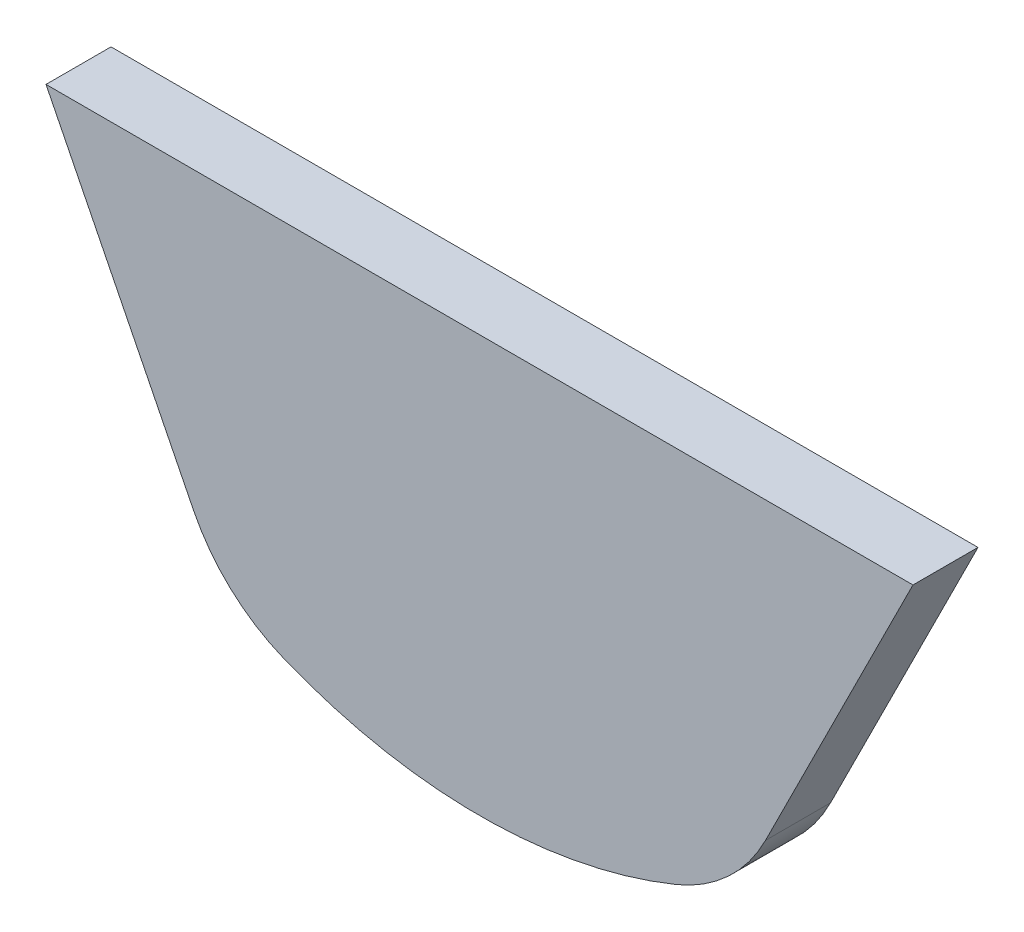
ISO-10303-21;
HEADER;
FILE_DESCRIPTION(('STEP AP214'),'2;1');
FILE_NAME('part.step','',(''),(''),'','','');
FILE_SCHEMA(('AUTOMOTIVE_DESIGN { 1 0 10303 214 1 1 1 1 }'));
ENDSEC;
DATA;
#1=APPLICATION_CONTEXT('core data for automotive mechanical design processes');
#2=APPLICATION_PROTOCOL_DEFINITION('international standard','automotive_design',2000,#1);
#3=PRODUCT_CONTEXT('',#1,'mechanical');
#4=PRODUCT('Part','Part','',(#3));
#5=PRODUCT_RELATED_PRODUCT_CATEGORY('part','',(#4));
#6=PRODUCT_DEFINITION_FORMATION('','',#4);
#7=PRODUCT_DEFINITION_CONTEXT('part definition',#1,'design');
#8=PRODUCT_DEFINITION('design','',#6,#7);
#9=PRODUCT_DEFINITION_SHAPE('','',#8);
#10=(LENGTH_UNIT() NAMED_UNIT(*) SI_UNIT(.MILLI.,.METRE.));
#11=(NAMED_UNIT(*) PLANE_ANGLE_UNIT() SI_UNIT($,.RADIAN.));
#12=(NAMED_UNIT(*) SI_UNIT($,.STERADIAN.) SOLID_ANGLE_UNIT());
#13=UNCERTAINTY_MEASURE_WITH_UNIT(LENGTH_MEASURE(1.E-05),#10,'distance_accuracy_value','');
#14=(GEOMETRIC_REPRESENTATION_CONTEXT(3) GLOBAL_UNCERTAINTY_ASSIGNED_CONTEXT((#13)) GLOBAL_UNIT_ASSIGNED_CONTEXT((#10,
#11,#12)) REPRESENTATION_CONTEXT('',''));
#15=CARTESIAN_POINT('',(0.,0.,0.));
#16=DIRECTION('',(0.,0.,1.));
#17=DIRECTION('',(1.,0.,0.));
#18=AXIS2_PLACEMENT_3D('',#15,#16,#17);
#19=CARTESIAN_POINT('',(-127.,0.,19.05));
#20=DIRECTION('',(0.894427190999916,0.447213595499958,0.));
#21=DIRECTION('',(-0.447213595499958,0.894427190999916,0.));
#22=AXIS2_PLACEMENT_3D('',#19,#20,#21);
#23=PLANE('',#22);
#24=DIRECTION('',(0.447213595499958,-0.894427190999916,0.));
#25=VECTOR('',#24,1.);
#26=CARTESIAN_POINT('',(-127.,0.,0.));
#27=LINE('',#26,#25);
#28=CARTESIAN_POINT('',(-127.,0.,0.));
#29=VERTEX_POINT('',#28);
#30=CARTESIAN_POINT('',(-83.7905524616866,-86.4188950766268,0.));
#31=VERTEX_POINT('',#30);
#32=EDGE_CURVE('E115',#29,#31,#27,.T.);
#33=ORIENTED_EDGE('',*,*,#32,.T.);
#34=DIRECTION('',(0.,0.,-1.));
#35=VECTOR('',#34,1.);
#36=CARTESIAN_POINT('',(-83.7905524616866,-86.4188950766268,19.05));
#37=LINE('',#36,#35);
#38=CARTESIAN_POINT('',(-83.7905524616866,-86.4188950766268,19.05));
#39=VERTEX_POINT('',#38);
#40=EDGE_CURVE('E11',#31,#39,#37,.F.);
#41=ORIENTED_EDGE('',*,*,#40,.T.);
#42=DIRECTION('',(0.447213595499958,-0.894427190999916,0.));
#43=VECTOR('',#42,1.);
#44=CARTESIAN_POINT('',(-127.,0.,19.05));
#45=LINE('',#44,#43);
#46=CARTESIAN_POINT('',(-127.,0.,19.05));
#47=VERTEX_POINT('',#46);
#48=EDGE_CURVE('E121',#47,#39,#45,.T.);
#49=ORIENTED_EDGE('',*,*,#48,.F.);
#50=DIRECTION('',(0.,0.,-1.));
#51=VECTOR('',#50,1.);
#52=CARTESIAN_POINT('',(-127.,0.,19.05));
#53=LINE('',#52,#51);
#54=EDGE_CURVE('E107',#47,#29,#53,.T.);
#55=ORIENTED_EDGE('',*,*,#54,.T.);
#56=EDGE_LOOP('',(#33,#41,#49,#55));
#57=FACE_BOUND('',#56,.T.);
#58=ADVANCED_FACE('F33',(#57),#23,.F.);
#59=CARTESIAN_POINT('',(0.,30.3822715367485,19.05));
#60=DIRECTION('',(0.,0.,-1.));
#61=DIRECTION('',(-1.,0.,0.));
#62=AXIS2_PLACEMENT_3D('',#59,#60,#61);
#63=CYLINDRICAL_SURFACE('',#62,152.4);
#64=CARTESIAN_POINT('',(0.,30.3822715367485,0.));
#65=DIRECTION('',(0.,0.,1.));
#66=DIRECTION('',(1.,0.,0.));
#67=AXIS2_PLACEMENT_3D('',#64,#65,#66);
#68=CIRCLE('',#67,152.4);
#69=CARTESIAN_POINT('',(-57.5304767383363,-110.741802406218,0.));
#70=VERTEX_POINT('',#69);
#71=CARTESIAN_POINT('',(57.5304767383364,-110.741802406218,0.));
#72=VERTEX_POINT('',#71);
#73=EDGE_CURVE('E117',#70,#72,#68,.T.);
#74=ORIENTED_EDGE('',*,*,#73,.T.);
#75=DIRECTION('',(0.,0.,-1.));
#76=VECTOR('',#75,1.);
#77=CARTESIAN_POINT('',(57.5304767383364,-110.741802406218,19.05));
#78=LINE('',#77,#76);
#79=CARTESIAN_POINT('',(57.5304767383364,-110.741802406218,19.05));
#80=VERTEX_POINT('',#79);
#81=EDGE_CURVE('E54',#72,#80,#78,.F.);
#82=ORIENTED_EDGE('',*,*,#81,.T.);
#83=CARTESIAN_POINT('',(0.,30.3822715367485,19.05));
#84=DIRECTION('',(0.,0.,1.));
#85=DIRECTION('',(1.,0.,0.));
#86=AXIS2_PLACEMENT_3D('',#83,#84,#85);
#87=CIRCLE('',#86,152.4);
#88=CARTESIAN_POINT('',(-57.5304767383363,-110.741802406218,19.05));
#89=VERTEX_POINT('',#88);
#90=EDGE_CURVE('E97',#89,#80,#87,.T.);
#91=ORIENTED_EDGE('',*,*,#90,.F.);
#92=DIRECTION('',(0.,0.,-1.));
#93=VECTOR('',#92,1.);
#94=CARTESIAN_POINT('',(-57.5304767383363,-110.741802406218,19.05));
#95=LINE('',#94,#93);
#96=EDGE_CURVE('E128',#89,#70,#95,.T.);
#97=ORIENTED_EDGE('',*,*,#96,.T.);
#98=EDGE_LOOP('',(#74,#82,#91,#97));
#99=FACE_BOUND('',#98,.T.);
#100=ADVANCED_FACE('F136',(#99),#63,.T.);
#101=CARTESIAN_POINT('',(76.2,-101.6,19.05));
#102=DIRECTION('',(-0.894427190999916,0.447213595499958,0.));
#103=DIRECTION('',(-0.447213595499958,-0.894427190999916,0.));
#104=AXIS2_PLACEMENT_3D('',#101,#102,#103);
#105=PLANE('',#104);
#106=DIRECTION('',(0.447213595499958,0.894427190999916,0.));
#107=VECTOR('',#106,1.);
#108=CARTESIAN_POINT('',(76.2,-101.6,19.05));
#109=LINE('',#108,#107);
#110=CARTESIAN_POINT('',(83.7905524616866,-86.4188950766267,19.05));
#111=VERTEX_POINT('',#110);
#112=CARTESIAN_POINT('',(127.,0.,19.05));
#113=VERTEX_POINT('',#112);
#114=EDGE_CURVE('E87',#111,#113,#109,.T.);
#115=ORIENTED_EDGE('',*,*,#114,.F.);
#116=DIRECTION('',(0.,0.,-1.));
#117=VECTOR('',#116,1.);
#118=CARTESIAN_POINT('',(83.7905524616866,-86.4188950766267,19.05));
#119=LINE('',#118,#117);
#120=CARTESIAN_POINT('',(83.7905524616866,-86.4188950766267,0.));
#121=VERTEX_POINT('',#120);
#122=EDGE_CURVE('E106',#111,#121,#119,.T.);
#123=ORIENTED_EDGE('',*,*,#122,.T.);
#124=DIRECTION('',(0.447213595499958,0.894427190999916,0.));
#125=VECTOR('',#124,1.);
#126=CARTESIAN_POINT('',(76.2,-101.6,0.));
#127=LINE('',#126,#125);
#128=CARTESIAN_POINT('',(127.,0.,0.));
#129=VERTEX_POINT('',#128);
#130=EDGE_CURVE('E103',#121,#129,#127,.T.);
#131=ORIENTED_EDGE('',*,*,#130,.T.);
#132=DIRECTION('',(0.,0.,-1.));
#133=VECTOR('',#132,1.);
#134=CARTESIAN_POINT('',(127.,0.,19.05));
#135=LINE('',#134,#133);
#136=EDGE_CURVE('E100',#113,#129,#135,.T.);
#137=ORIENTED_EDGE('',*,*,#136,.F.);
#138=EDGE_LOOP('',(#115,#123,#131,#137));
#139=FACE_BOUND('',#138,.T.);
#140=ADVANCED_FACE('F101',(#139),#105,.F.);
#141=CARTESIAN_POINT('',(-127.,0.,19.05));
#142=DIRECTION('',(0.,-1.,0.));
#143=DIRECTION('',(0.,0.,-1.));
#144=AXIS2_PLACEMENT_3D('',#141,#142,#143);
#145=PLANE('',#144);
#146=DIRECTION('',(-1.,0.,0.));
#147=VECTOR('',#146,1.);
#148=CARTESIAN_POINT('',(-127.,0.,0.));
#149=LINE('',#148,#147);
#150=EDGE_CURVE('E120',#129,#29,#149,.T.);
#151=ORIENTED_EDGE('',*,*,#150,.T.);
#152=ORIENTED_EDGE('',*,*,#54,.F.);
#153=DIRECTION('',(-1.,0.,0.));
#154=VECTOR('',#153,1.);
#155=CARTESIAN_POINT('',(-127.,0.,19.05));
#156=LINE('',#155,#154);
#157=EDGE_CURVE('E91',#113,#47,#156,.T.);
#158=ORIENTED_EDGE('',*,*,#157,.F.);
#159=ORIENTED_EDGE('',*,*,#136,.T.);
#160=EDGE_LOOP('',(#151,#152,#158,#159));
#161=FACE_BOUND('',#160,.T.);
#162=ADVANCED_FACE('F109',(#161),#145,.F.);
#163=CARTESIAN_POINT('',(0.,30.3822715367485,19.05));
#164=DIRECTION('',(0.,0.,1.));
#165=DIRECTION('',(1.,0.,0.));
#166=AXIS2_PLACEMENT_3D('',#163,#164,#165);
#167=PLANE('',#166);
#168=ORIENTED_EDGE('',*,*,#90,.T.);
#169=CARTESIAN_POINT('',(38.3536511588909,-63.7004444252289,19.05));
#170=DIRECTION('',(0.,0.,1.));
#171=DIRECTION('',(1.,0.,0.));
#172=AXIS2_PLACEMENT_3D('',#169,#170,#171);
#173=CIRCLE('',#172,50.8);
#174=EDGE_CURVE('E41',#80,#111,#173,.T.);
#175=ORIENTED_EDGE('',*,*,#174,.T.);
#176=ORIENTED_EDGE('',*,*,#114,.T.);
#177=ORIENTED_EDGE('',*,*,#157,.T.);
#178=ORIENTED_EDGE('',*,*,#48,.T.);
#179=CARTESIAN_POINT('',(-38.3536511588909,-63.7004444252289,19.05));
#180=DIRECTION('',(0.,0.,1.));
#181=DIRECTION('',(1.,0.,0.));
#182=AXIS2_PLACEMENT_3D('',#179,#180,#181);
#183=CIRCLE('',#182,50.8);
#184=EDGE_CURVE('E132',#39,#89,#183,.T.);
#185=ORIENTED_EDGE('',*,*,#184,.T.);
#186=EDGE_LOOP('',(#168,#175,#176,#177,#178,#185));
#187=FACE_BOUND('',#186,.T.);
#188=ADVANCED_FACE('F89',(#187),#167,.T.);
#189=CARTESIAN_POINT('',(0.,30.3822715367485,0.));
#190=DIRECTION('',(0.,0.,1.));
#191=DIRECTION('',(1.,0.,0.));
#192=AXIS2_PLACEMENT_3D('',#189,#190,#191);
#193=PLANE('',#192);
#194=ORIENTED_EDGE('',*,*,#130,.F.);
#195=CARTESIAN_POINT('',(38.3536511588909,-63.7004444252289,0.));
#196=DIRECTION('',(0.,0.,1.));
#197=DIRECTION('',(1.,0.,0.));
#198=AXIS2_PLACEMENT_3D('',#195,#196,#197);
#199=CIRCLE('',#198,50.8);
#200=EDGE_CURVE('E126',#121,#72,#199,.F.);
#201=ORIENTED_EDGE('',*,*,#200,.T.);
#202=ORIENTED_EDGE('',*,*,#73,.F.);
#203=CARTESIAN_POINT('',(-38.3536511588909,-63.7004444252289,0.));
#204=DIRECTION('',(0.,0.,1.));
#205=DIRECTION('',(1.,0.,0.));
#206=AXIS2_PLACEMENT_3D('',#203,#204,#205);
#207=CIRCLE('',#206,50.8);
#208=EDGE_CURVE('E124',#70,#31,#207,.F.);
#209=ORIENTED_EDGE('',*,*,#208,.T.);
#210=ORIENTED_EDGE('',*,*,#32,.F.);
#211=ORIENTED_EDGE('',*,*,#150,.F.);
#212=EDGE_LOOP('',(#194,#201,#202,#209,#210,#211));
#213=FACE_BOUND('',#212,.T.);
#214=ADVANCED_FACE('F140',(#213),#193,.F.);
#215=CARTESIAN_POINT('',(38.3536511588909,-63.7004444252289,19.05));
#216=DIRECTION('',(0.,0.,-1.));
#217=DIRECTION('',(-1.,0.,0.));
#218=AXIS2_PLACEMENT_3D('',#215,#216,#217);
#219=CYLINDRICAL_SURFACE('',#218,50.8);
#220=ORIENTED_EDGE('',*,*,#174,.F.);
#221=ORIENTED_EDGE('',*,*,#81,.F.);
#222=ORIENTED_EDGE('',*,*,#200,.F.);
#223=ORIENTED_EDGE('',*,*,#122,.F.);
#224=EDGE_LOOP('',(#220,#221,#222,#223));
#225=FACE_BOUND('',#224,.T.);
#226=ADVANCED_FACE('F149',(#225),#219,.T.);
#227=CARTESIAN_POINT('',(-38.3536511588909,-63.7004444252289,19.05));
#228=DIRECTION('',(0.,0.,-1.));
#229=DIRECTION('',(-1.,0.,0.));
#230=AXIS2_PLACEMENT_3D('',#227,#228,#229);
#231=CYLINDRICAL_SURFACE('',#230,50.8);
#232=ORIENTED_EDGE('',*,*,#184,.F.);
#233=ORIENTED_EDGE('',*,*,#40,.F.);
#234=ORIENTED_EDGE('',*,*,#208,.F.);
#235=ORIENTED_EDGE('',*,*,#96,.F.);
#236=EDGE_LOOP('',(#232,#233,#234,#235));
#237=FACE_BOUND('',#236,.T.);
#238=ADVANCED_FACE('F35',(#237),#231,.T.);
#239=CLOSED_SHELL('',(#58,#100,#140,#162,#188,#214,#226,#238));
#240=MANIFOLD_SOLID_BREP('B2',#239);
#241=ADVANCED_BREP_SHAPE_REPRESENTATION('',(#18,#240),#14);
#242=SHAPE_DEFINITION_REPRESENTATION(#9,#241);
ENDSEC;
END-ISO-10303-21;
